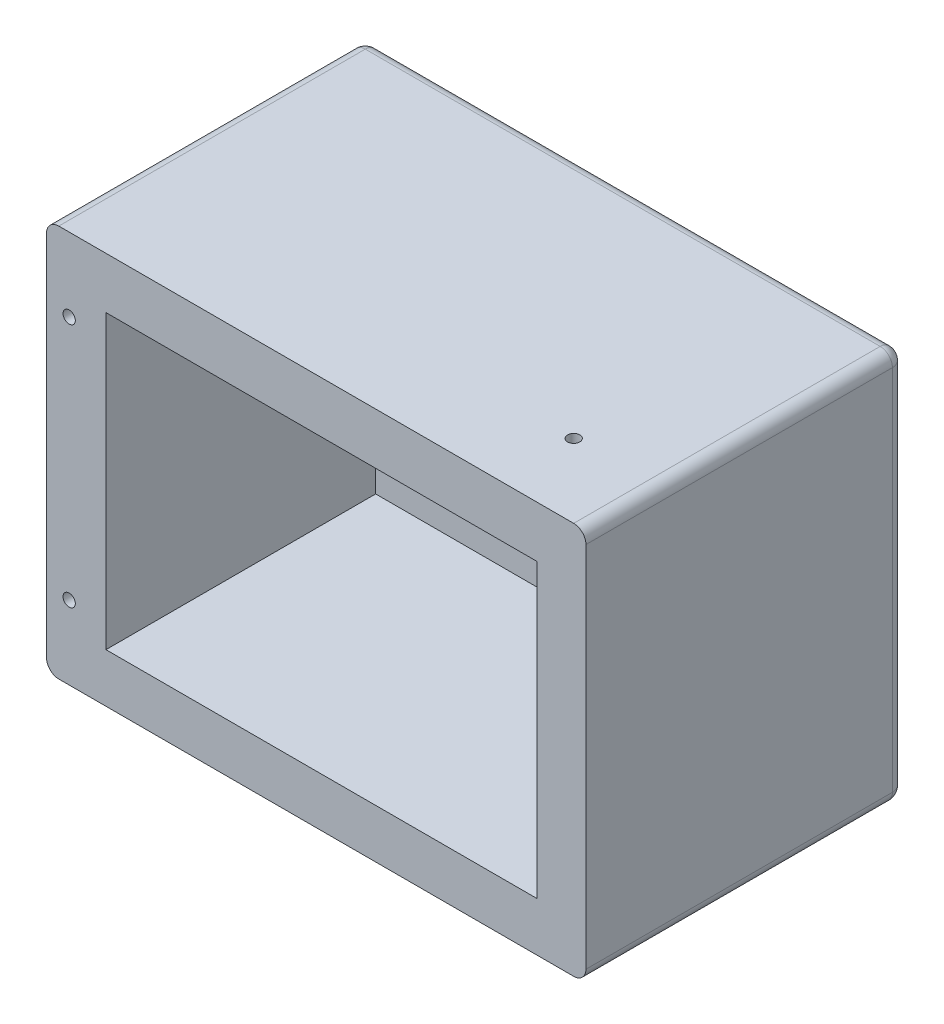
ISO-10303-21;
HEADER;
FILE_DESCRIPTION(('STEP AP214'),'2;1');
FILE_NAME('part.step','',(''),(''),'','','');
FILE_SCHEMA(('AUTOMOTIVE_DESIGN { 1 0 10303 214 1 1 1 1 }'));
ENDSEC;
DATA;
#1=APPLICATION_CONTEXT('core data for automotive mechanical design processes');
#2=APPLICATION_PROTOCOL_DEFINITION('international standard','automotive_design',2000,#1);
#3=PRODUCT_CONTEXT('',#1,'mechanical');
#4=PRODUCT('Part','Part','',(#3));
#5=PRODUCT_RELATED_PRODUCT_CATEGORY('part','',(#4));
#6=PRODUCT_DEFINITION_FORMATION('','',#4);
#7=PRODUCT_DEFINITION_CONTEXT('part definition',#1,'design');
#8=PRODUCT_DEFINITION('design','',#6,#7);
#9=PRODUCT_DEFINITION_SHAPE('','',#8);
#10=(LENGTH_UNIT() NAMED_UNIT(*) SI_UNIT(.MILLI.,.METRE.));
#11=(NAMED_UNIT(*) PLANE_ANGLE_UNIT() SI_UNIT($,.RADIAN.));
#12=(NAMED_UNIT(*) SI_UNIT($,.STERADIAN.) SOLID_ANGLE_UNIT());
#13=UNCERTAINTY_MEASURE_WITH_UNIT(LENGTH_MEASURE(1.E-05),#10,'distance_accuracy_value','');
#14=(GEOMETRIC_REPRESENTATION_CONTEXT(3) GLOBAL_UNCERTAINTY_ASSIGNED_CONTEXT((#13)) GLOBAL_UNIT_ASSIGNED_CONTEXT((#10,
#11,#12)) REPRESENTATION_CONTEXT('',''));
#15=CARTESIAN_POINT('',(0.,0.,0.));
#16=DIRECTION('',(0.,0.,1.));
#17=DIRECTION('',(1.,0.,0.));
#18=AXIS2_PLACEMENT_3D('',#15,#16,#17);
#19=CARTESIAN_POINT('',(0.,-320.,260.));
#20=DIRECTION('',(1.,0.,0.));
#21=DIRECTION('',(0.,1.,0.));
#22=AXIS2_PLACEMENT_3D('',#19,#20,#21);
#23=PLANE('',#22);
#24=DIRECTION('',(0.,-1.,0.));
#25=VECTOR('',#24,1.);
#26=CARTESIAN_POINT('',(0.,-320.,260.));
#27=LINE('',#26,#25);
#28=CARTESIAN_POINT('',(0.,-10.,260.));
#29=VERTEX_POINT('',#28);
#30=CARTESIAN_POINT('',(0.,-310.,260.));
#31=VERTEX_POINT('',#30);
#32=EDGE_CURVE('E196',#29,#31,#27,.T.);
#33=ORIENTED_EDGE('',*,*,#32,.F.);
#34=DIRECTION('',(0.,0.,-1.));
#35=VECTOR('',#34,1.);
#36=CARTESIAN_POINT('',(0.,-10.,260.));
#37=LINE('',#36,#35);
#38=CARTESIAN_POINT('',(0.,-10.,10.));
#39=VERTEX_POINT('',#38);
#40=EDGE_CURVE('E255',#29,#39,#37,.T.);
#41=ORIENTED_EDGE('',*,*,#40,.T.);
#42=DIRECTION('',(0.,-1.,0.));
#43=VECTOR('',#42,1.);
#44=CARTESIAN_POINT('',(0.,-320.,10.));
#45=LINE('',#44,#43);
#46=CARTESIAN_POINT('',(0.,-310.,10.));
#47=VERTEX_POINT('',#46);
#48=EDGE_CURVE('E252',#39,#47,#45,.T.);
#49=ORIENTED_EDGE('',*,*,#48,.T.);
#50=DIRECTION('',(0.,0.,-1.));
#51=VECTOR('',#50,1.);
#52=CARTESIAN_POINT('',(0.,-310.,260.));
#53=LINE('',#52,#51);
#54=EDGE_CURVE('E249',#47,#31,#53,.F.);
#55=ORIENTED_EDGE('',*,*,#54,.T.);
#56=EDGE_LOOP('',(#33,#41,#49,#55));
#57=FACE_BOUND('',#56,.T.);
#58=ADVANCED_FACE('F44',(#57),#23,.F.);
#59=CARTESIAN_POINT('',(440.,-320.,260.));
#60=DIRECTION('',(0.,1.,0.));
#61=DIRECTION('',(-1.,0.,0.));
#62=AXIS2_PLACEMENT_3D('',#59,#60,#61);
#63=PLANE('',#62);
#64=DIRECTION('',(1.,0.,0.));
#65=VECTOR('',#64,1.);
#66=CARTESIAN_POINT('',(440.,-320.,260.));
#67=LINE('',#66,#65);
#68=CARTESIAN_POINT('',(10.,-320.,260.));
#69=VERTEX_POINT('',#68);
#70=CARTESIAN_POINT('',(430.,-320.,260.));
#71=VERTEX_POINT('',#70);
#72=EDGE_CURVE('E205',#69,#71,#67,.T.);
#73=ORIENTED_EDGE('',*,*,#72,.F.);
#74=DIRECTION('',(0.,0.,-1.));
#75=VECTOR('',#74,1.);
#76=CARTESIAN_POINT('',(10.,-320.,260.));
#77=LINE('',#76,#75);
#78=CARTESIAN_POINT('',(10.,-320.,10.));
#79=VERTEX_POINT('',#78);
#80=EDGE_CURVE('E224',#69,#79,#77,.T.);
#81=ORIENTED_EDGE('',*,*,#80,.T.);
#82=DIRECTION('',(1.,0.,0.));
#83=VECTOR('',#82,1.);
#84=CARTESIAN_POINT('',(440.,-320.,10.));
#85=LINE('',#84,#83);
#86=CARTESIAN_POINT('',(430.,-320.,10.));
#87=VERTEX_POINT('',#86);
#88=EDGE_CURVE('E220',#79,#87,#85,.T.);
#89=ORIENTED_EDGE('',*,*,#88,.T.);
#90=DIRECTION('',(0.,0.,-1.));
#91=VECTOR('',#90,1.);
#92=CARTESIAN_POINT('',(430.,-320.,260.));
#93=LINE('',#92,#91);
#94=EDGE_CURVE('E217',#87,#71,#93,.F.);
#95=ORIENTED_EDGE('',*,*,#94,.T.);
#96=EDGE_LOOP('',(#73,#81,#89,#95));
#97=FACE_BOUND('',#96,.T.);
#98=ADVANCED_FACE('F346',(#97),#63,.F.);
#99=CARTESIAN_POINT('',(440.,0.,260.));
#100=DIRECTION('',(-1.,0.,0.));
#101=DIRECTION('',(0.,0.,1.));
#102=AXIS2_PLACEMENT_3D('',#99,#100,#101);
#103=PLANE('',#102);
#104=DIRECTION('',(0.,1.,0.));
#105=VECTOR('',#104,1.);
#106=CARTESIAN_POINT('',(440.,0.,260.));
#107=LINE('',#106,#105);
#108=CARTESIAN_POINT('',(440.,-310.,260.));
#109=VERTEX_POINT('',#108);
#110=CARTESIAN_POINT('',(440.,-10.,260.));
#111=VERTEX_POINT('',#110);
#112=EDGE_CURVE('E209',#109,#111,#107,.T.);
#113=ORIENTED_EDGE('',*,*,#112,.F.);
#114=DIRECTION('',(0.,0.,-1.));
#115=VECTOR('',#114,1.);
#116=CARTESIAN_POINT('',(440.,-310.,260.));
#117=LINE('',#116,#115);
#118=CARTESIAN_POINT('',(440.,-310.,10.));
#119=VERTEX_POINT('',#118);
#120=EDGE_CURVE('E11',#109,#119,#117,.T.);
#121=ORIENTED_EDGE('',*,*,#120,.T.);
#122=DIRECTION('',(0.,1.,0.));
#123=VECTOR('',#122,1.);
#124=CARTESIAN_POINT('',(440.,0.,10.));
#125=LINE('',#124,#123);
#126=CARTESIAN_POINT('',(440.,-10.,10.));
#127=VERTEX_POINT('',#126);
#128=EDGE_CURVE('E54',#119,#127,#125,.T.);
#129=ORIENTED_EDGE('',*,*,#128,.T.);
#130=DIRECTION('',(0.,0.,-1.));
#131=VECTOR('',#130,1.);
#132=CARTESIAN_POINT('',(440.,-10.,260.));
#133=LINE('',#132,#131);
#134=EDGE_CURVE('E270',#127,#111,#133,.F.);
#135=ORIENTED_EDGE('',*,*,#134,.T.);
#136=EDGE_LOOP('',(#113,#121,#129,#135));
#137=FACE_BOUND('',#136,.T.);
#138=ADVANCED_FACE('F353',(#137),#103,.F.);
#139=CARTESIAN_POINT('',(0.,0.,260.));
#140=DIRECTION('',(0.,-1.,0.));
#141=DIRECTION('',(0.,0.,-1.));
#142=AXIS2_PLACEMENT_3D('',#139,#140,#141);
#143=PLANE('',#142);
#144=CARTESIAN_POINT('',(370.,0.,200.));
#145=DIRECTION('',(0.,1.,0.));
#146=DIRECTION('',(0.,0.,1.));
#147=AXIS2_PLACEMENT_3D('',#144,#145,#146);
#148=CIRCLE('',#147,4.99999999999999);
#149=CARTESIAN_POINT('',(370.,0.,205.));
#150=VERTEX_POINT('',#149);
#151=EDGE_CURVE('E637',#150,#150,#148,.T.);
#152=ORIENTED_EDGE('',*,*,#151,.F.);
#153=EDGE_LOOP('',(#152));
#154=FACE_BOUND('',#153,.T.);
#155=DIRECTION('',(-1.,0.,0.));
#156=VECTOR('',#155,1.);
#157=CARTESIAN_POINT('',(0.,0.,10.));
#158=LINE('',#157,#156);
#159=CARTESIAN_POINT('',(430.,0.,10.));
#160=VERTEX_POINT('',#159);
#161=CARTESIAN_POINT('',(10.,0.,10.));
#162=VERTEX_POINT('',#161);
#163=EDGE_CURVE('E243',#160,#162,#158,.T.);
#164=ORIENTED_EDGE('',*,*,#163,.T.);
#165=DIRECTION('',(0.,0.,-1.));
#166=VECTOR('',#165,1.);
#167=CARTESIAN_POINT('',(10.,0.,260.));
#168=LINE('',#167,#166);
#169=CARTESIAN_POINT('',(10.,0.,260.));
#170=VERTEX_POINT('',#169);
#171=EDGE_CURVE('E246',#162,#170,#168,.F.);
#172=ORIENTED_EDGE('',*,*,#171,.T.);
#173=DIRECTION('',(-1.,0.,0.));
#174=VECTOR('',#173,1.);
#175=CARTESIAN_POINT('',(0.,0.,260.));
#176=LINE('',#175,#174);
#177=CARTESIAN_POINT('',(430.,0.,260.));
#178=VERTEX_POINT('',#177);
#179=EDGE_CURVE('E213',#178,#170,#176,.T.);
#180=ORIENTED_EDGE('',*,*,#179,.F.);
#181=DIRECTION('',(0.,0.,-1.));
#182=VECTOR('',#181,1.);
#183=CARTESIAN_POINT('',(430.,0.,260.));
#184=LINE('',#183,#182);
#185=EDGE_CURVE('E240',#178,#160,#184,.T.);
#186=ORIENTED_EDGE('',*,*,#185,.T.);
#187=EDGE_LOOP('',(#164,#172,#180,#186));
#188=FACE_BOUND('',#187,.T.);
#189=ADVANCED_FACE('F372',(#154,#188),#143,.F.);
#190=CARTESIAN_POINT('',(0.,0.,260.));
#191=DIRECTION('',(0.,0.,-1.));
#192=DIRECTION('',(-1.,0.,0.));
#193=AXIS2_PLACEMENT_3D('',#190,#191,#192);
#194=PLANE('',#193);
#195=CARTESIAN_POINT('',(18.4707631686556,-60.,260.));
#196=DIRECTION('',(0.,0.,1.));
#197=DIRECTION('',(1.,0.,0.));
#198=AXIS2_PLACEMENT_3D('',#195,#196,#197);
#199=CIRCLE('',#198,5.);
#200=CARTESIAN_POINT('',(23.4707631686556,-60.,260.));
#201=VERTEX_POINT('',#200);
#202=EDGE_CURVE('E649',#201,#201,#199,.T.);
#203=ORIENTED_EDGE('',*,*,#202,.F.);
#204=EDGE_LOOP('',(#203));
#205=FACE_BOUND('',#204,.T.);
#206=CARTESIAN_POINT('',(18.4707631686556,-260.,260.));
#207=DIRECTION('',(0.,0.,1.));
#208=DIRECTION('',(1.,0.,0.));
#209=AXIS2_PLACEMENT_3D('',#206,#207,#208);
#210=CIRCLE('',#209,5.);
#211=CARTESIAN_POINT('',(23.4707631686556,-260.,260.));
#212=VERTEX_POINT('',#211);
#213=EDGE_CURVE('E642',#212,#212,#210,.T.);
#214=ORIENTED_EDGE('',*,*,#213,.F.);
#215=EDGE_LOOP('',(#214));
#216=FACE_BOUND('',#215,.T.);
#217=DIRECTION('',(1.,0.,0.));
#218=VECTOR('',#217,1.);
#219=CARTESIAN_POINT('',(48.4707631686556,-280.,260.));
#220=LINE('',#219,#218);
#221=CARTESIAN_POINT('',(48.4707631686556,-280.,260.));
#222=VERTEX_POINT('',#221);
#223=CARTESIAN_POINT('',(400.,-280.,260.));
#224=VERTEX_POINT('',#223);
#225=EDGE_CURVE('E187',#222,#224,#220,.T.);
#226=ORIENTED_EDGE('',*,*,#225,.F.);
#227=DIRECTION('',(0.,-1.,0.));
#228=VECTOR('',#227,1.);
#229=CARTESIAN_POINT('',(48.4707631686556,-41.8672911787667,260.));
#230=LINE('',#229,#228);
#231=CARTESIAN_POINT('',(48.4707631686556,-41.8672911787667,260.));
#232=VERTEX_POINT('',#231);
#233=EDGE_CURVE('E151',#232,#222,#230,.T.);
#234=ORIENTED_EDGE('',*,*,#233,.F.);
#235=DIRECTION('',(-1.,0.,0.));
#236=VECTOR('',#235,1.);
#237=CARTESIAN_POINT('',(48.4707631686556,-41.8672911787667,260.));
#238=LINE('',#237,#236);
#239=CARTESIAN_POINT('',(400.,-41.8672911787667,260.));
#240=VERTEX_POINT('',#239);
#241=EDGE_CURVE('E171',#240,#232,#238,.T.);
#242=ORIENTED_EDGE('',*,*,#241,.F.);
#243=DIRECTION('',(0.,1.,0.));
#244=VECTOR('',#243,1.);
#245=CARTESIAN_POINT('',(400.,-41.8672911787667,260.));
#246=LINE('',#245,#244);
#247=EDGE_CURVE('E175',#224,#240,#246,.T.);
#248=ORIENTED_EDGE('',*,*,#247,.F.);
#249=EDGE_LOOP('',(#226,#234,#242,#248));
#250=FACE_BOUND('',#249,.T.);
#251=ORIENTED_EDGE('',*,*,#179,.T.);
#252=CARTESIAN_POINT('',(10.,-10.,260.));
#253=DIRECTION('',(0.,0.,-1.));
#254=DIRECTION('',(-1.,0.,0.));
#255=AXIS2_PLACEMENT_3D('',#252,#253,#254);
#256=CIRCLE('',#255,10.);
#257=EDGE_CURVE('E267',#170,#29,#256,.F.);
#258=ORIENTED_EDGE('',*,*,#257,.T.);
#259=ORIENTED_EDGE('',*,*,#32,.T.);
#260=CARTESIAN_POINT('',(10.,-310.,260.));
#261=DIRECTION('',(0.,0.,-1.));
#262=DIRECTION('',(-1.,0.,0.));
#263=AXIS2_PLACEMENT_3D('',#260,#261,#262);
#264=CIRCLE('',#263,10.);
#265=EDGE_CURVE('E264',#31,#69,#264,.F.);
#266=ORIENTED_EDGE('',*,*,#265,.T.);
#267=ORIENTED_EDGE('',*,*,#72,.T.);
#268=CARTESIAN_POINT('',(430.,-310.,260.));
#269=DIRECTION('',(0.,0.,-1.));
#270=DIRECTION('',(-1.,0.,0.));
#271=AXIS2_PLACEMENT_3D('',#268,#269,#270);
#272=CIRCLE('',#271,10.);
#273=EDGE_CURVE('E261',#71,#109,#272,.F.);
#274=ORIENTED_EDGE('',*,*,#273,.T.);
#275=ORIENTED_EDGE('',*,*,#112,.T.);
#276=CARTESIAN_POINT('',(430.,-10.,260.));
#277=DIRECTION('',(0.,0.,-1.));
#278=DIRECTION('',(-1.,0.,0.));
#279=AXIS2_PLACEMENT_3D('',#276,#277,#278);
#280=CIRCLE('',#279,10.);
#281=EDGE_CURVE('E258',#111,#178,#280,.F.);
#282=ORIENTED_EDGE('',*,*,#281,.T.);
#283=EDGE_LOOP('',(#251,#258,#259,#266,#267,#274,#275,#282));
#284=FACE_BOUND('',#283,.T.);
#285=ADVANCED_FACE('F343',(#205,#216,#250,#284),#194,.F.);
#286=CARTESIAN_POINT('',(0.,0.,0.));
#287=DIRECTION('',(0.,0.,-1.));
#288=DIRECTION('',(-1.,0.,0.));
#289=AXIS2_PLACEMENT_3D('',#286,#287,#288);
#290=PLANE('',#289);
#291=DIRECTION('',(1.,0.,0.));
#292=VECTOR('',#291,1.);
#293=CARTESIAN_POINT('',(0.,-310.,0.));
#294=LINE('',#293,#292);
#295=CARTESIAN_POINT('',(430.,-310.,0.));
#296=VERTEX_POINT('',#295);
#297=CARTESIAN_POINT('',(10.,-310.,0.));
#298=VERTEX_POINT('',#297);
#299=EDGE_CURVE('E233',#296,#298,#294,.F.);
#300=ORIENTED_EDGE('',*,*,#299,.T.);
#301=DIRECTION('',(0.,-1.,0.));
#302=VECTOR('',#301,1.);
#303=CARTESIAN_POINT('',(10.,0.,0.));
#304=LINE('',#303,#302);
#305=CARTESIAN_POINT('',(10.,-10.,0.));
#306=VERTEX_POINT('',#305);
#307=EDGE_CURVE('E237',#298,#306,#304,.F.);
#308=ORIENTED_EDGE('',*,*,#307,.T.);
#309=DIRECTION('',(-1.,0.,0.));
#310=VECTOR('',#309,1.);
#311=CARTESIAN_POINT('',(440.,-10.,0.));
#312=LINE('',#311,#310);
#313=CARTESIAN_POINT('',(430.,-10.,0.));
#314=VERTEX_POINT('',#313);
#315=EDGE_CURVE('E230',#306,#314,#312,.F.);
#316=ORIENTED_EDGE('',*,*,#315,.T.);
#317=DIRECTION('',(0.,1.,0.));
#318=VECTOR('',#317,1.);
#319=CARTESIAN_POINT('',(430.,-320.,0.));
#320=LINE('',#319,#318);
#321=EDGE_CURVE('E227',#314,#296,#320,.F.);
#322=ORIENTED_EDGE('',*,*,#321,.T.);
#323=EDGE_LOOP('',(#300,#308,#316,#322));
#324=FACE_BOUND('',#323,.T.);
#325=ADVANCED_FACE('F368',(#324),#290,.T.);
#326=CARTESIAN_POINT('',(48.4707631686556,-41.8672911787667,40.));
#327=DIRECTION('',(-1.,0.,0.));
#328=DIRECTION('',(0.,-1.,0.));
#329=AXIS2_PLACEMENT_3D('',#326,#327,#328);
#330=PLANE('',#329);
#331=ORIENTED_EDGE('',*,*,#233,.T.);
#332=DIRECTION('',(0.,0.,1.));
#333=VECTOR('',#332,1.);
#334=CARTESIAN_POINT('',(48.4707631686556,-280.,40.));
#335=LINE('',#334,#333);
#336=CARTESIAN_POINT('',(48.4707631686556,-280.,40.));
#337=VERTEX_POINT('',#336);
#338=EDGE_CURVE('E144',#337,#222,#335,.T.);
#339=ORIENTED_EDGE('',*,*,#338,.F.);
#340=DIRECTION('',(0.,-1.,0.));
#341=VECTOR('',#340,1.);
#342=CARTESIAN_POINT('',(48.4707631686556,-41.8672911787667,40.));
#343=LINE('',#342,#341);
#344=CARTESIAN_POINT('',(48.4707631686556,-41.8672911787667,40.));
#345=VERTEX_POINT('',#344);
#346=EDGE_CURVE('E148',#345,#337,#343,.T.);
#347=ORIENTED_EDGE('',*,*,#346,.F.);
#348=DIRECTION('',(0.,0.,1.));
#349=VECTOR('',#348,1.);
#350=CARTESIAN_POINT('',(48.4707631686556,-41.8672911787667,40.));
#351=LINE('',#350,#349);
#352=EDGE_CURVE('E193',#345,#232,#351,.T.);
#353=ORIENTED_EDGE('',*,*,#352,.T.);
#354=EDGE_LOOP('',(#331,#339,#347,#353));
#355=FACE_BOUND('',#354,.T.);
#356=ADVANCED_FACE('F146',(#355),#330,.F.);
#357=CARTESIAN_POINT('',(48.4707631686556,-41.8672911787667,40.));
#358=DIRECTION('',(0.,1.,0.));
#359=DIRECTION('',(0.,0.,1.));
#360=AXIS2_PLACEMENT_3D('',#357,#358,#359);
#361=PLANE('',#360);
#362=ORIENTED_EDGE('',*,*,#241,.T.);
#363=ORIENTED_EDGE('',*,*,#352,.F.);
#364=DIRECTION('',(-1.,0.,0.));
#365=VECTOR('',#364,1.);
#366=CARTESIAN_POINT('',(48.4707631686556,-41.8672911787667,40.));
#367=LINE('',#366,#365);
#368=CARTESIAN_POINT('',(400.,-41.8672911787667,40.));
#369=VERTEX_POINT('',#368);
#370=EDGE_CURVE('E157',#369,#345,#367,.T.);
#371=ORIENTED_EDGE('',*,*,#370,.F.);
#372=DIRECTION('',(0.,0.,1.));
#373=VECTOR('',#372,1.);
#374=CARTESIAN_POINT('',(400.,-41.8672911787667,40.));
#375=LINE('',#374,#373);
#376=EDGE_CURVE('E197',#369,#240,#375,.T.);
#377=ORIENTED_EDGE('',*,*,#376,.T.);
#378=EDGE_LOOP('',(#362,#363,#371,#377));
#379=FACE_BOUND('',#378,.T.);
#380=ADVANCED_FACE('F582',(#379),#361,.F.);
#381=CARTESIAN_POINT('',(400.,-41.8672911787667,40.));
#382=DIRECTION('',(1.,0.,0.));
#383=DIRECTION('',(0.,1.,0.));
#384=AXIS2_PLACEMENT_3D('',#381,#382,#383);
#385=PLANE('',#384);
#386=ORIENTED_EDGE('',*,*,#247,.T.);
#387=ORIENTED_EDGE('',*,*,#376,.F.);
#388=DIRECTION('',(0.,1.,0.));
#389=VECTOR('',#388,1.);
#390=CARTESIAN_POINT('',(400.,-41.8672911787667,40.));
#391=LINE('',#390,#389);
#392=CARTESIAN_POINT('',(400.,-280.,40.));
#393=VERTEX_POINT('',#392);
#394=EDGE_CURVE('E166',#393,#369,#391,.T.);
#395=ORIENTED_EDGE('',*,*,#394,.F.);
#396=DIRECTION('',(0.,0.,1.));
#397=VECTOR('',#396,1.);
#398=CARTESIAN_POINT('',(400.,-280.,40.));
#399=LINE('',#398,#397);
#400=EDGE_CURVE('E156',#393,#224,#399,.T.);
#401=ORIENTED_EDGE('',*,*,#400,.T.);
#402=EDGE_LOOP('',(#386,#387,#395,#401));
#403=FACE_BOUND('',#402,.T.);
#404=ADVANCED_FACE('F574',(#403),#385,.F.);
#405=CARTESIAN_POINT('',(48.4707631686556,-280.,40.));
#406=DIRECTION('',(0.,-1.,0.));
#407=DIRECTION('',(0.,0.,-1.));
#408=AXIS2_PLACEMENT_3D('',#405,#406,#407);
#409=PLANE('',#408);
#410=ORIENTED_EDGE('',*,*,#225,.T.);
#411=ORIENTED_EDGE('',*,*,#400,.F.);
#412=DIRECTION('',(1.,0.,0.));
#413=VECTOR('',#412,1.);
#414=CARTESIAN_POINT('',(48.4707631686556,-280.,40.));
#415=LINE('',#414,#413);
#416=EDGE_CURVE('E160',#337,#393,#415,.T.);
#417=ORIENTED_EDGE('',*,*,#416,.F.);
#418=ORIENTED_EDGE('',*,*,#338,.T.);
#419=EDGE_LOOP('',(#410,#411,#417,#418));
#420=FACE_BOUND('',#419,.T.);
#421=ADVANCED_FACE('F161',(#420),#409,.F.);
#422=CARTESIAN_POINT('',(0.,0.,40.));
#423=DIRECTION('',(0.,0.,1.));
#424=DIRECTION('',(1.,0.,0.));
#425=AXIS2_PLACEMENT_3D('',#422,#423,#424);
#426=PLANE('',#425);
#427=ORIENTED_EDGE('',*,*,#346,.T.);
#428=ORIENTED_EDGE('',*,*,#416,.T.);
#429=ORIENTED_EDGE('',*,*,#394,.T.);
#430=ORIENTED_EDGE('',*,*,#370,.T.);
#431=EDGE_LOOP('',(#427,#428,#429,#430));
#432=FACE_BOUND('',#431,.T.);
#433=ADVANCED_FACE('F168',(#432),#426,.T.);
#434=CARTESIAN_POINT('',(10.,-10.,260.));
#435=DIRECTION('',(0.,0.,-1.));
#436=DIRECTION('',(-1.,0.,0.));
#437=AXIS2_PLACEMENT_3D('',#434,#435,#436);
#438=CYLINDRICAL_SURFACE('',#437,10.);
#439=ORIENTED_EDGE('',*,*,#257,.F.);
#440=ORIENTED_EDGE('',*,*,#171,.F.);
#441=CARTESIAN_POINT('',(10.,-10.,10.));
#442=DIRECTION('',(0.,0.,-1.));
#443=DIRECTION('',(-1.,0.,0.));
#444=AXIS2_PLACEMENT_3D('',#441,#442,#443);
#445=CIRCLE('',#444,10.);
#446=EDGE_CURVE('E313',#39,#162,#445,.T.);
#447=ORIENTED_EDGE('',*,*,#446,.F.);
#448=ORIENTED_EDGE('',*,*,#40,.F.);
#449=EDGE_LOOP('',(#439,#440,#447,#448));
#450=FACE_BOUND('',#449,.T.);
#451=ADVANCED_FACE('F46',(#450),#438,.T.);
#452=CARTESIAN_POINT('',(430.,-10.,260.));
#453=DIRECTION('',(0.,0.,-1.));
#454=DIRECTION('',(-1.,0.,0.));
#455=AXIS2_PLACEMENT_3D('',#452,#453,#454);
#456=CYLINDRICAL_SURFACE('',#455,10.);
#457=ORIENTED_EDGE('',*,*,#281,.F.);
#458=ORIENTED_EDGE('',*,*,#134,.F.);
#459=CARTESIAN_POINT('',(430.,-10.,10.));
#460=DIRECTION('',(0.,0.,-1.));
#461=DIRECTION('',(-1.,0.,0.));
#462=AXIS2_PLACEMENT_3D('',#459,#460,#461);
#463=CIRCLE('',#462,10.);
#464=EDGE_CURVE('E310',#160,#127,#463,.T.);
#465=ORIENTED_EDGE('',*,*,#464,.F.);
#466=ORIENTED_EDGE('',*,*,#185,.F.);
#467=EDGE_LOOP('',(#457,#458,#465,#466));
#468=FACE_BOUND('',#467,.T.);
#469=ADVANCED_FACE('F356',(#468),#456,.T.);
#470=CARTESIAN_POINT('',(0.,-10.,10.));
#471=DIRECTION('',(1.,0.,0.));
#472=DIRECTION('',(0.,0.,-1.));
#473=AXIS2_PLACEMENT_3D('',#470,#471,#472);
#474=CYLINDRICAL_SURFACE('',#473,10.);
#475=CARTESIAN_POINT('',(10.,-10.,10.));
#476=DIRECTION('',(-1.,0.,0.));
#477=DIRECTION('',(0.,0.,1.));
#478=AXIS2_PLACEMENT_3D('',#475,#476,#477);
#479=CIRCLE('',#478,10.);
#480=EDGE_CURVE('E48',#162,#306,#479,.T.);
#481=ORIENTED_EDGE('',*,*,#480,.F.);
#482=ORIENTED_EDGE('',*,*,#163,.F.);
#483=CARTESIAN_POINT('',(430.,-10.,10.));
#484=DIRECTION('',(1.,0.,0.));
#485=DIRECTION('',(0.,0.,-1.));
#486=AXIS2_PLACEMENT_3D('',#483,#484,#485);
#487=CIRCLE('',#486,10.);
#488=EDGE_CURVE('E306',#314,#160,#487,.T.);
#489=ORIENTED_EDGE('',*,*,#488,.F.);
#490=ORIENTED_EDGE('',*,*,#315,.F.);
#491=EDGE_LOOP('',(#481,#482,#489,#490));
#492=FACE_BOUND('',#491,.T.);
#493=ADVANCED_FACE('F369',(#492),#474,.T.);
#494=CARTESIAN_POINT('',(10.,-10.,10.));
#495=DIRECTION('',(0.,1.,0.));
#496=DIRECTION('',(0.,0.,1.));
#497=AXIS2_PLACEMENT_3D('',#494,#495,#496);
#498=SPHERICAL_SURFACE('',#497,10.);
#499=ORIENTED_EDGE('',*,*,#446,.T.);
#500=ORIENTED_EDGE('',*,*,#480,.T.);
#501=CARTESIAN_POINT('',(10.,-10.,10.));
#502=DIRECTION('',(0.,1.,0.));
#503=DIRECTION('',(-1.,0.,0.));
#504=AXIS2_PLACEMENT_3D('',#501,#502,#503);
#505=CIRCLE('',#504,10.);
#506=EDGE_CURVE('E302',#39,#306,#505,.F.);
#507=ORIENTED_EDGE('',*,*,#506,.F.);
#508=EDGE_LOOP('',(#499,#500,#507));
#509=FACE_BOUND('',#508,.T.);
#510=ADVANCED_FACE('F322',(#509),#498,.T.);
#511=CARTESIAN_POINT('',(430.,-10.,10.));
#512=DIRECTION('',(0.,1.,0.));
#513=DIRECTION('',(0.,0.,1.));
#514=AXIS2_PLACEMENT_3D('',#511,#512,#513);
#515=SPHERICAL_SURFACE('',#514,10.);
#516=ORIENTED_EDGE('',*,*,#488,.T.);
#517=ORIENTED_EDGE('',*,*,#464,.T.);
#518=CARTESIAN_POINT('',(430.,-10.,10.));
#519=DIRECTION('',(0.,1.,0.));
#520=DIRECTION('',(0.,0.,1.));
#521=AXIS2_PLACEMENT_3D('',#518,#519,#520);
#522=CIRCLE('',#521,10.);
#523=EDGE_CURVE('E298',#314,#127,#522,.F.);
#524=ORIENTED_EDGE('',*,*,#523,.F.);
#525=EDGE_LOOP('',(#516,#517,#524));
#526=FACE_BOUND('',#525,.T.);
#527=ADVANCED_FACE('F360',(#526),#515,.T.);
#528=CARTESIAN_POINT('',(10.,-320.,10.));
#529=DIRECTION('',(0.,1.,0.));
#530=DIRECTION('',(-1.,0.,0.));
#531=AXIS2_PLACEMENT_3D('',#528,#529,#530);
#532=CYLINDRICAL_SURFACE('',#531,10.);
#533=ORIENTED_EDGE('',*,*,#506,.T.);
#534=ORIENTED_EDGE('',*,*,#307,.F.);
#535=CARTESIAN_POINT('',(10.,-310.,10.));
#536=DIRECTION('',(0.,-1.,0.));
#537=DIRECTION('',(0.,0.,-1.));
#538=AXIS2_PLACEMENT_3D('',#535,#536,#537);
#539=CIRCLE('',#538,10.);
#540=EDGE_CURVE('E294',#47,#298,#539,.T.);
#541=ORIENTED_EDGE('',*,*,#540,.F.);
#542=ORIENTED_EDGE('',*,*,#48,.F.);
#543=EDGE_LOOP('',(#533,#534,#541,#542));
#544=FACE_BOUND('',#543,.T.);
#545=ADVANCED_FACE('F329',(#544),#532,.T.);
#546=CARTESIAN_POINT('',(10.,-310.,260.));
#547=DIRECTION('',(0.,0.,-1.));
#548=DIRECTION('',(-1.,0.,0.));
#549=AXIS2_PLACEMENT_3D('',#546,#547,#548);
#550=CYLINDRICAL_SURFACE('',#549,10.);
#551=ORIENTED_EDGE('',*,*,#265,.F.);
#552=ORIENTED_EDGE('',*,*,#54,.F.);
#553=CARTESIAN_POINT('',(10.,-310.,10.));
#554=DIRECTION('',(0.,0.,-1.));
#555=DIRECTION('',(-1.,0.,0.));
#556=AXIS2_PLACEMENT_3D('',#553,#554,#555);
#557=CIRCLE('',#556,10.);
#558=EDGE_CURVE('E290',#79,#47,#557,.T.);
#559=ORIENTED_EDGE('',*,*,#558,.F.);
#560=ORIENTED_EDGE('',*,*,#80,.F.);
#561=EDGE_LOOP('',(#551,#552,#559,#560));
#562=FACE_BOUND('',#561,.T.);
#563=ADVANCED_FACE('F338',(#562),#550,.T.);
#564=CARTESIAN_POINT('',(430.,-310.,260.));
#565=DIRECTION('',(0.,0.,-1.));
#566=DIRECTION('',(-1.,0.,0.));
#567=AXIS2_PLACEMENT_3D('',#564,#565,#566);
#568=CYLINDRICAL_SURFACE('',#567,10.);
#569=ORIENTED_EDGE('',*,*,#273,.F.);
#570=ORIENTED_EDGE('',*,*,#94,.F.);
#571=CARTESIAN_POINT('',(430.,-310.,10.));
#572=DIRECTION('',(0.,0.,-1.));
#573=DIRECTION('',(-1.,0.,0.));
#574=AXIS2_PLACEMENT_3D('',#571,#572,#573);
#575=CIRCLE('',#574,10.);
#576=EDGE_CURVE('E286',#119,#87,#575,.T.);
#577=ORIENTED_EDGE('',*,*,#576,.F.);
#578=ORIENTED_EDGE('',*,*,#120,.F.);
#579=EDGE_LOOP('',(#569,#570,#577,#578));
#580=FACE_BOUND('',#579,.T.);
#581=ADVANCED_FACE('F351',(#580),#568,.T.);
#582=CARTESIAN_POINT('',(430.,0.,10.));
#583=DIRECTION('',(0.,-1.,0.));
#584=DIRECTION('',(0.,0.,-1.));
#585=AXIS2_PLACEMENT_3D('',#582,#583,#584);
#586=CYLINDRICAL_SURFACE('',#585,10.);
#587=ORIENTED_EDGE('',*,*,#523,.T.);
#588=ORIENTED_EDGE('',*,*,#128,.F.);
#589=CARTESIAN_POINT('',(430.,-310.,10.));
#590=DIRECTION('',(0.,-1.,0.));
#591=DIRECTION('',(0.,0.,-1.));
#592=AXIS2_PLACEMENT_3D('',#589,#590,#591);
#593=CIRCLE('',#592,10.);
#594=EDGE_CURVE('E282',#296,#119,#593,.T.);
#595=ORIENTED_EDGE('',*,*,#594,.F.);
#596=ORIENTED_EDGE('',*,*,#321,.F.);
#597=EDGE_LOOP('',(#587,#588,#595,#596));
#598=FACE_BOUND('',#597,.T.);
#599=ADVANCED_FACE('F364',(#598),#586,.T.);
#600=CARTESIAN_POINT('',(10.,-310.,10.));
#601=DIRECTION('',(-1.,0.,0.));
#602=DIRECTION('',(0.,0.,1.));
#603=AXIS2_PLACEMENT_3D('',#600,#601,#602);
#604=SPHERICAL_SURFACE('',#603,10.);
#605=ORIENTED_EDGE('',*,*,#558,.T.);
#606=ORIENTED_EDGE('',*,*,#540,.T.);
#607=CARTESIAN_POINT('',(10.,-310.,10.));
#608=DIRECTION('',(-1.,0.,0.));
#609=DIRECTION('',(0.,-1.,0.));
#610=AXIS2_PLACEMENT_3D('',#607,#608,#609);
#611=CIRCLE('',#610,10.);
#612=EDGE_CURVE('E278',#79,#298,#611,.F.);
#613=ORIENTED_EDGE('',*,*,#612,.F.);
#614=EDGE_LOOP('',(#605,#606,#613));
#615=FACE_BOUND('',#614,.T.);
#616=ADVANCED_FACE('F399',(#615),#604,.T.);
#617=CARTESIAN_POINT('',(430.,-310.,10.));
#618=DIRECTION('',(1.,0.,0.));
#619=DIRECTION('',(0.,0.,-1.));
#620=AXIS2_PLACEMENT_3D('',#617,#618,#619);
#621=SPHERICAL_SURFACE('',#620,10.);
#622=ORIENTED_EDGE('',*,*,#594,.T.);
#623=ORIENTED_EDGE('',*,*,#576,.T.);
#624=CARTESIAN_POINT('',(430.,-310.,10.));
#625=DIRECTION('',(1.,0.,0.));
#626=DIRECTION('',(0.,0.,-1.));
#627=AXIS2_PLACEMENT_3D('',#624,#625,#626);
#628=CIRCLE('',#627,10.);
#629=EDGE_CURVE('E275',#296,#87,#628,.F.);
#630=ORIENTED_EDGE('',*,*,#629,.F.);
#631=EDGE_LOOP('',(#622,#623,#630));
#632=FACE_BOUND('',#631,.T.);
#633=ADVANCED_FACE('F395',(#632),#621,.T.);
#634=CARTESIAN_POINT('',(440.,-310.,10.));
#635=DIRECTION('',(-1.,0.,0.));
#636=DIRECTION('',(0.,-1.,0.));
#637=AXIS2_PLACEMENT_3D('',#634,#635,#636);
#638=CYLINDRICAL_SURFACE('',#637,10.);
#639=ORIENTED_EDGE('',*,*,#612,.T.);
#640=ORIENTED_EDGE('',*,*,#299,.F.);
#641=ORIENTED_EDGE('',*,*,#629,.T.);
#642=ORIENTED_EDGE('',*,*,#88,.F.);
#643=EDGE_LOOP('',(#639,#640,#641,#642));
#644=FACE_BOUND('',#643,.T.);
#645=ADVANCED_FACE('F391',(#644),#638,.T.);
#646=CARTESIAN_POINT('',(18.4707631686556,-260.,250.));
#647=DIRECTION('',(0.,0.,1.));
#648=DIRECTION('',(1.,0.,0.));
#649=AXIS2_PLACEMENT_3D('',#646,#647,#648);
#650=CYLINDRICAL_SURFACE('',#649,5.);
#651=CARTESIAN_POINT('',(18.4707631686556,-260.,250.));
#652=DIRECTION('',(0.,0.,1.));
#653=DIRECTION('',(1.,0.,0.));
#654=AXIS2_PLACEMENT_3D('',#651,#652,#653);
#655=CIRCLE('',#654,5.);
#656=CARTESIAN_POINT('',(23.4707631686556,-260.,250.));
#657=VERTEX_POINT('',#656);
#658=EDGE_CURVE('E178',#657,#657,#655,.T.);
#659=ORIENTED_EDGE('',*,*,#658,.F.);
#660=EDGE_LOOP('',(#659));
#661=FACE_BOUND('',#660,.T.);
#662=ORIENTED_EDGE('',*,*,#213,.T.);
#663=EDGE_LOOP('',(#662));
#664=FACE_BOUND('',#663,.T.);
#665=ADVANCED_FACE('F394',(#661,#664),#650,.F.);
#666=CARTESIAN_POINT('',(18.4707631686556,-260.,250.));
#667=DIRECTION('',(0.,0.,1.));
#668=DIRECTION('',(1.,0.,0.));
#669=AXIS2_PLACEMENT_3D('',#666,#667,#668);
#670=PLANE('',#669);
#671=ORIENTED_EDGE('',*,*,#658,.T.);
#672=EDGE_LOOP('',(#671));
#673=FACE_BOUND('',#672,.T.);
#674=ADVANCED_FACE('F483',(#673),#670,.T.);
#675=CARTESIAN_POINT('',(18.4707631686556,-60.,250.));
#676=DIRECTION('',(0.,0.,1.));
#677=DIRECTION('',(1.,0.,0.));
#678=AXIS2_PLACEMENT_3D('',#675,#676,#677);
#679=CYLINDRICAL_SURFACE('',#678,5.);
#680=CARTESIAN_POINT('',(18.4707631686556,-60.,250.));
#681=DIRECTION('',(0.,0.,1.));
#682=DIRECTION('',(1.,0.,0.));
#683=AXIS2_PLACEMENT_3D('',#680,#681,#682);
#684=CIRCLE('',#683,5.);
#685=CARTESIAN_POINT('',(23.4707631686556,-60.,250.));
#686=VERTEX_POINT('',#685);
#687=EDGE_CURVE('E279',#686,#686,#684,.T.);
#688=ORIENTED_EDGE('',*,*,#687,.F.);
#689=EDGE_LOOP('',(#688));
#690=FACE_BOUND('',#689,.T.);
#691=ORIENTED_EDGE('',*,*,#202,.T.);
#692=EDGE_LOOP('',(#691));
#693=FACE_BOUND('',#692,.T.);
#694=ADVANCED_FACE('F492',(#690,#693),#679,.F.);
#695=CARTESIAN_POINT('',(18.4707631686556,-60.,250.));
#696=DIRECTION('',(0.,0.,1.));
#697=DIRECTION('',(1.,0.,0.));
#698=AXIS2_PLACEMENT_3D('',#695,#696,#697);
#699=PLANE('',#698);
#700=ORIENTED_EDGE('',*,*,#687,.T.);
#701=EDGE_LOOP('',(#700));
#702=FACE_BOUND('',#701,.T.);
#703=ADVANCED_FACE('F501',(#702),#699,.T.);
#704=CARTESIAN_POINT('',(370.,-10.,200.));
#705=DIRECTION('',(0.,1.,0.));
#706=DIRECTION('',(0.,0.,1.));
#707=AXIS2_PLACEMENT_3D('',#704,#705,#706);
#708=CYLINDRICAL_SURFACE('',#707,4.99999999999999);
#709=CARTESIAN_POINT('',(370.,-10.,200.));
#710=DIRECTION('',(0.,1.,0.));
#711=DIRECTION('',(0.,0.,1.));
#712=AXIS2_PLACEMENT_3D('',#709,#710,#711);
#713=CIRCLE('',#712,4.99999999999999);
#714=CARTESIAN_POINT('',(370.,-10.,205.));
#715=VERTEX_POINT('',#714);
#716=EDGE_CURVE('E635',#715,#715,#713,.T.);
#717=ORIENTED_EDGE('',*,*,#716,.F.);
#718=EDGE_LOOP('',(#717));
#719=FACE_BOUND('',#718,.T.);
#720=ORIENTED_EDGE('',*,*,#151,.T.);
#721=EDGE_LOOP('',(#720));
#722=FACE_BOUND('',#721,.T.);
#723=ADVANCED_FACE('F510',(#719,#722),#708,.F.);
#724=CARTESIAN_POINT('',(370.,-10.,200.));
#725=DIRECTION('',(0.,1.,0.));
#726=DIRECTION('',(0.,0.,1.));
#727=AXIS2_PLACEMENT_3D('',#724,#725,#726);
#728=PLANE('',#727);
#729=ORIENTED_EDGE('',*,*,#716,.T.);
#730=EDGE_LOOP('',(#729));
#731=FACE_BOUND('',#730,.T.);
#732=ADVANCED_FACE('F527',(#731),#728,.T.);
#733=CLOSED_SHELL('',(#58,#98,#138,#189,#285,#325,#356,#380,#404,#421,#433,#451,#469,#493,#510,
#527,#545,#563,#581,#599,#616,#633,#645,#665,#674,#694,#703,#723,#732));
#734=MANIFOLD_SOLID_BREP('B2',#733);
#735=ADVANCED_BREP_SHAPE_REPRESENTATION('',(#18,#734),#14);
#736=SHAPE_DEFINITION_REPRESENTATION(#9,#735);
ENDSEC;
END-ISO-10303-21;
